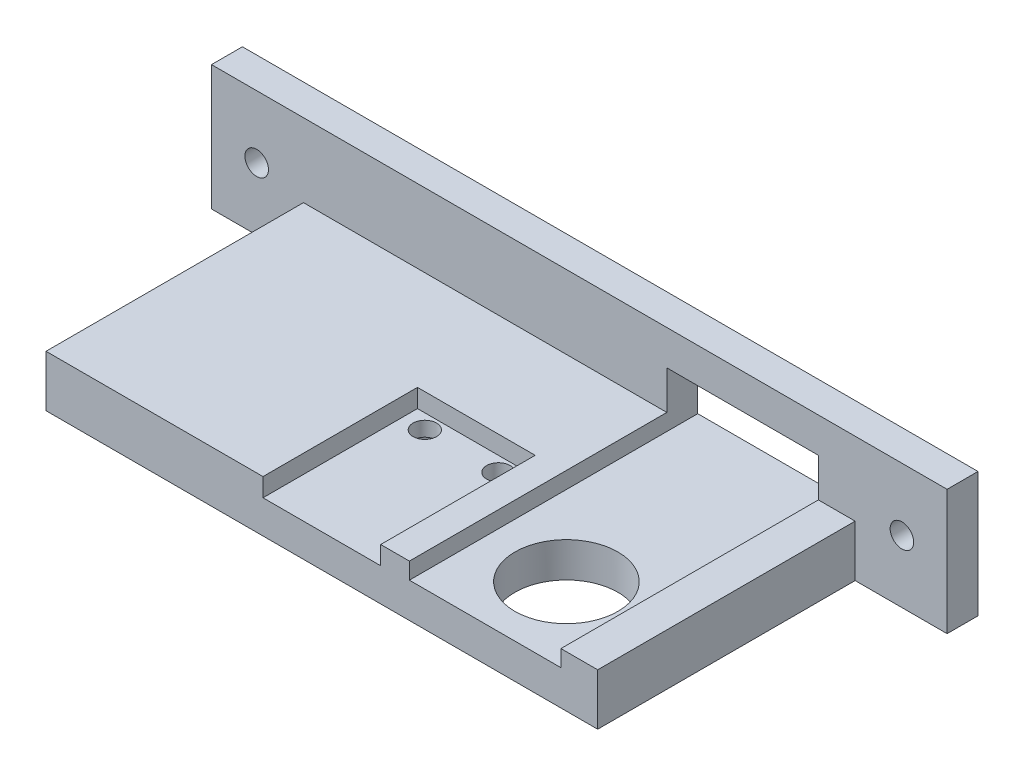
ISO-10303-21;
HEADER;
FILE_DESCRIPTION(('STEP AP214'),'2;1');
FILE_NAME('part.step','',(''),(''),'','','');
FILE_SCHEMA(('AUTOMOTIVE_DESIGN { 1 0 10303 214 1 1 1 1 }'));
ENDSEC;
DATA;
#1=APPLICATION_CONTEXT('core data for automotive mechanical design processes');
#2=APPLICATION_PROTOCOL_DEFINITION('international standard','automotive_design',2000,#1);
#3=PRODUCT_CONTEXT('',#1,'mechanical');
#4=PRODUCT('Part','Part','',(#3));
#5=PRODUCT_RELATED_PRODUCT_CATEGORY('part','',(#4));
#6=PRODUCT_DEFINITION_FORMATION('','',#4);
#7=PRODUCT_DEFINITION_CONTEXT('part definition',#1,'design');
#8=PRODUCT_DEFINITION('design','',#6,#7);
#9=PRODUCT_DEFINITION_SHAPE('','',#8);
#10=(LENGTH_UNIT() NAMED_UNIT(*) SI_UNIT(.MILLI.,.METRE.));
#11=(NAMED_UNIT(*) PLANE_ANGLE_UNIT() SI_UNIT($,.RADIAN.));
#12=(NAMED_UNIT(*) SI_UNIT($,.STERADIAN.) SOLID_ANGLE_UNIT());
#13=UNCERTAINTY_MEASURE_WITH_UNIT(LENGTH_MEASURE(1.E-05),#10,'distance_accuracy_value','');
#14=(GEOMETRIC_REPRESENTATION_CONTEXT(3) GLOBAL_UNCERTAINTY_ASSIGNED_CONTEXT((#13)) GLOBAL_UNIT_ASSIGNED_CONTEXT((#10,
#11,#12)) REPRESENTATION_CONTEXT('',''));
#15=CARTESIAN_POINT('',(0.,0.,0.));
#16=DIRECTION('',(0.,0.,1.));
#17=DIRECTION('',(1.,0.,0.));
#18=AXIS2_PLACEMENT_3D('',#15,#16,#17);
#19=CARTESIAN_POINT('',(0.,7.,0.));
#20=DIRECTION('',(0.,1.,0.));
#21=DIRECTION('',(0.,0.,1.));
#22=AXIS2_PLACEMENT_3D('',#19,#20,#21);
#23=PLANE('',#22);
#24=DIRECTION('',(0.,0.,1.));
#25=VECTOR('',#24,1.);
#26=CARTESIAN_POINT('',(11.9,7.,0.));
#27=LINE('',#26,#25);
#28=CARTESIAN_POINT('',(11.9,7.,-6.29809068669829));
#29=VERTEX_POINT('',#28);
#30=CARTESIAN_POINT('',(11.9,7.,28.7019093133017));
#31=VERTEX_POINT('',#30);
#32=EDGE_CURVE('E344',#29,#31,#27,.T.);
#33=ORIENTED_EDGE('',*,*,#32,.F.);
#34=DIRECTION('',(1.,0.,0.));
#35=VECTOR('',#34,1.);
#36=CARTESIAN_POINT('',(50.,7.,-6.29809068669829));
#37=LINE('',#36,#35);
#38=CARTESIAN_POINT('',(-37.5,7.,-6.29809068669829));
#39=VERTEX_POINT('',#38);
#40=EDGE_CURVE('E12',#39,#29,#37,.T.);
#41=ORIENTED_EDGE('',*,*,#40,.F.);
#42=DIRECTION('',(0.,0.,-1.));
#43=VECTOR('',#42,1.);
#44=CARTESIAN_POINT('',(-37.5,7.,0.));
#45=LINE('',#44,#43);
#46=CARTESIAN_POINT('',(-37.5,7.,28.7019093133017));
#47=VERTEX_POINT('',#46);
#48=EDGE_CURVE('E549',#47,#39,#45,.T.);
#49=ORIENTED_EDGE('',*,*,#48,.F.);
#50=DIRECTION('',(-1.,0.,0.));
#51=VECTOR('',#50,1.);
#52=CARTESIAN_POINT('',(37.5,7.,28.7019093133017));
#53=LINE('',#52,#51);
#54=CARTESIAN_POINT('',(-8.,7.,28.7019093133017));
#55=VERTEX_POINT('',#54);
#56=EDGE_CURVE('E606',#55,#47,#53,.T.);
#57=ORIENTED_EDGE('',*,*,#56,.F.);
#58=DIRECTION('',(0.,0.,1.));
#59=VECTOR('',#58,1.);
#60=CARTESIAN_POINT('',(-8.,7.,0.));
#61=LINE('',#60,#59);
#62=CARTESIAN_POINT('',(-8.,7.,7.70190931330171));
#63=VERTEX_POINT('',#62);
#64=EDGE_CURVE('E514',#63,#55,#61,.T.);
#65=ORIENTED_EDGE('',*,*,#64,.F.);
#66=DIRECTION('',(-1.,0.,0.));
#67=VECTOR('',#66,1.);
#68=CARTESIAN_POINT('',(0.,7.,7.70190931330171));
#69=LINE('',#68,#67);
#70=CARTESIAN_POINT('',(8.,7.,7.70190931330171));
#71=VERTEX_POINT('',#70);
#72=EDGE_CURVE('E529',#71,#63,#69,.T.);
#73=ORIENTED_EDGE('',*,*,#72,.F.);
#74=DIRECTION('',(0.,0.,1.));
#75=VECTOR('',#74,1.);
#76=CARTESIAN_POINT('',(8.,7.,0.));
#77=LINE('',#76,#75);
#78=CARTESIAN_POINT('',(8.,7.,28.7019093133017));
#79=VERTEX_POINT('',#78);
#80=EDGE_CURVE('E504',#71,#79,#77,.T.);
#81=ORIENTED_EDGE('',*,*,#80,.T.);
#82=EDGE_CURVE('E605',#31,#79,#53,.T.);
#83=ORIENTED_EDGE('',*,*,#82,.F.);
#84=EDGE_LOOP('',(#33,#41,#49,#57,#65,#73,#81,#83));
#85=FACE_BOUND('',#84,.T.);
#86=ADVANCED_FACE('F77',(#85),#23,.T.);
#87=CARTESIAN_POINT('',(5.,0.,9.7019093133017));
#88=DIRECTION('',(0.,1.,0.));
#89=DIRECTION('',(0.,0.,1.));
#90=AXIS2_PLACEMENT_3D('',#87,#88,#89);
#91=CYLINDRICAL_SURFACE('',#90,1.6);
#92=CARTESIAN_POINT('',(5.,4.5,9.7019093133017));
#93=DIRECTION('',(0.,1.,0.));
#94=DIRECTION('',(0.,0.,1.));
#95=AXIS2_PLACEMENT_3D('',#92,#93,#94);
#96=CIRCLE('',#95,1.6);
#97=CARTESIAN_POINT('',(5.,4.5,11.3019093133017));
#98=VERTEX_POINT('',#97);
#99=EDGE_CURVE('E505',#98,#98,#96,.T.);
#100=ORIENTED_EDGE('',*,*,#99,.T.);
#101=EDGE_LOOP('',(#100));
#102=FACE_BOUND('',#101,.T.);
#103=CARTESIAN_POINT('',(5.,2.5,9.7019093133017));
#104=DIRECTION('',(0.,-1.,0.));
#105=DIRECTION('',(0.,0.,-1.));
#106=AXIS2_PLACEMENT_3D('',#103,#104,#105);
#107=CIRCLE('',#106,1.6);
#108=CARTESIAN_POINT('',(5.,2.5,8.1019093133017));
#109=VERTEX_POINT('',#108);
#110=EDGE_CURVE('E509',#109,#109,#107,.F.);
#111=ORIENTED_EDGE('',*,*,#110,.F.);
#112=EDGE_LOOP('',(#111));
#113=FACE_BOUND('',#112,.T.);
#114=ADVANCED_FACE('F624',(#102,#113),#91,.F.);
#115=CARTESIAN_POINT('',(-5.,0.,9.70190931330171));
#116=DIRECTION('',(0.,1.,0.));
#117=DIRECTION('',(0.,0.,1.));
#118=AXIS2_PLACEMENT_3D('',#115,#116,#117);
#119=CYLINDRICAL_SURFACE('',#118,1.6);
#120=CARTESIAN_POINT('',(-5.,4.5,9.70190931330171));
#121=DIRECTION('',(0.,1.,0.));
#122=DIRECTION('',(0.,0.,1.));
#123=AXIS2_PLACEMENT_3D('',#120,#121,#122);
#124=CIRCLE('',#123,1.6);
#125=CARTESIAN_POINT('',(-5.,4.5,11.3019093133017));
#126=VERTEX_POINT('',#125);
#127=EDGE_CURVE('E500',#126,#126,#124,.T.);
#128=ORIENTED_EDGE('',*,*,#127,.T.);
#129=EDGE_LOOP('',(#128));
#130=FACE_BOUND('',#129,.T.);
#131=CARTESIAN_POINT('',(-5.,2.5,9.70190931330171));
#132=DIRECTION('',(0.,-1.,0.));
#133=DIRECTION('',(0.,0.,-1.));
#134=AXIS2_PLACEMENT_3D('',#131,#132,#133);
#135=CIRCLE('',#134,1.6);
#136=CARTESIAN_POINT('',(-5.,2.5,8.10190931330171));
#137=VERTEX_POINT('',#136);
#138=EDGE_CURVE('E420',#137,#137,#135,.F.);
#139=ORIENTED_EDGE('',*,*,#138,.F.);
#140=EDGE_LOOP('',(#139));
#141=FACE_BOUND('',#140,.T.);
#142=ADVANCED_FACE('F626',(#130,#141),#119,.F.);
#143=DIRECTION('',(0.,0.,-1.));
#144=VECTOR('',#143,1.);
#145=CARTESIAN_POINT('',(32.5,7.,0.));
#146=LINE('',#145,#144);
#147=CARTESIAN_POINT('',(32.5,7.,28.7019093133017));
#148=VERTEX_POINT('',#147);
#149=CARTESIAN_POINT('',(32.5,7.,-6.29809068669829));
#150=VERTEX_POINT('',#149);
#151=EDGE_CURVE('E337',#148,#150,#146,.T.);
#152=ORIENTED_EDGE('',*,*,#151,.F.);
#153=CARTESIAN_POINT('',(37.5,7.,28.7019093133017));
#154=VERTEX_POINT('',#153);
#155=EDGE_CURVE('E304',#154,#148,#53,.T.);
#156=ORIENTED_EDGE('',*,*,#155,.F.);
#157=DIRECTION('',(0.,0.,-1.));
#158=VECTOR('',#157,1.);
#159=CARTESIAN_POINT('',(37.5,7.,0.));
#160=LINE('',#159,#158);
#161=CARTESIAN_POINT('',(37.5,7.,-6.29809068669829));
#162=VERTEX_POINT('',#161);
#163=EDGE_CURVE('E553',#154,#162,#160,.T.);
#164=ORIENTED_EDGE('',*,*,#163,.T.);
#165=EDGE_CURVE('E87',#150,#162,#37,.T.);
#166=ORIENTED_EDGE('',*,*,#165,.F.);
#167=EDGE_LOOP('',(#152,#156,#164,#166));
#168=FACE_BOUND('',#167,.T.);
#169=ADVANCED_FACE('F633',(#168),#23,.T.);
#170=CARTESIAN_POINT('',(37.5,7.,28.7019093133017));
#171=DIRECTION('',(0.,0.,1.));
#172=DIRECTION('',(1.,0.,0.));
#173=AXIS2_PLACEMENT_3D('',#170,#171,#172);
#174=PLANE('',#173);
#175=DIRECTION('',(0.,1.,0.));
#176=VECTOR('',#175,1.);
#177=CARTESIAN_POINT('',(11.9,12.25,28.7019093133017));
#178=LINE('',#177,#176);
#179=CARTESIAN_POINT('',(11.9,4.74999999999999,28.7019093133017));
#180=VERTEX_POINT('',#179);
#181=EDGE_CURVE('E306',#180,#31,#178,.T.);
#182=ORIENTED_EDGE('',*,*,#181,.T.);
#183=ORIENTED_EDGE('',*,*,#82,.T.);
#184=DIRECTION('',(0.,1.,0.));
#185=VECTOR('',#184,1.);
#186=CARTESIAN_POINT('',(8.,4.5,28.7019093133017));
#187=LINE('',#186,#185);
#188=CARTESIAN_POINT('',(8.,4.5,28.7019093133017));
#189=VERTEX_POINT('',#188);
#190=EDGE_CURVE('E535',#189,#79,#187,.T.);
#191=ORIENTED_EDGE('',*,*,#190,.F.);
#192=DIRECTION('',(1.,0.,0.));
#193=VECTOR('',#192,1.);
#194=CARTESIAN_POINT('',(0.,4.5,28.7019093133017));
#195=LINE('',#194,#193);
#196=CARTESIAN_POINT('',(-8.,4.5,28.7019093133017));
#197=VERTEX_POINT('',#196);
#198=EDGE_CURVE('E521',#197,#189,#195,.T.);
#199=ORIENTED_EDGE('',*,*,#198,.F.);
#200=DIRECTION('',(0.,1.,0.));
#201=VECTOR('',#200,1.);
#202=CARTESIAN_POINT('',(-8.,4.5,28.7019093133017));
#203=LINE('',#202,#201);
#204=EDGE_CURVE('E540',#197,#55,#203,.T.);
#205=ORIENTED_EDGE('',*,*,#204,.T.);
#206=ORIENTED_EDGE('',*,*,#56,.T.);
#207=DIRECTION('',(0.,-1.,0.));
#208=VECTOR('',#207,1.);
#209=CARTESIAN_POINT('',(-37.5,7.,28.7019093133017));
#210=LINE('',#209,#208);
#211=CARTESIAN_POINT('',(-37.5,0.,28.7019093133017));
#212=VERTEX_POINT('',#211);
#213=EDGE_CURVE('E604',#47,#212,#210,.T.);
#214=ORIENTED_EDGE('',*,*,#213,.T.);
#215=DIRECTION('',(-1.,0.,0.));
#216=VECTOR('',#215,1.);
#217=CARTESIAN_POINT('',(37.5,0.,28.7019093133017));
#218=LINE('',#217,#216);
#219=CARTESIAN_POINT('',(37.5,0.,28.7019093133017));
#220=VERTEX_POINT('',#219);
#221=EDGE_CURVE('E539',#220,#212,#218,.T.);
#222=ORIENTED_EDGE('',*,*,#221,.F.);
#223=DIRECTION('',(0.,-1.,0.));
#224=VECTOR('',#223,1.);
#225=CARTESIAN_POINT('',(37.5,7.,28.7019093133017));
#226=LINE('',#225,#224);
#227=EDGE_CURVE('E564',#154,#220,#226,.T.);
#228=ORIENTED_EDGE('',*,*,#227,.F.);
#229=ORIENTED_EDGE('',*,*,#155,.T.);
#230=DIRECTION('',(0.,-1.,0.));
#231=VECTOR('',#230,1.);
#232=CARTESIAN_POINT('',(32.5,12.25,28.7019093133017));
#233=LINE('',#232,#231);
#234=CARTESIAN_POINT('',(32.5,4.74999999999999,28.7019093133017));
#235=VERTEX_POINT('',#234);
#236=EDGE_CURVE('E281',#148,#235,#233,.T.);
#237=ORIENTED_EDGE('',*,*,#236,.T.);
#238=DIRECTION('',(-1.,0.,0.));
#239=VECTOR('',#238,1.);
#240=CARTESIAN_POINT('',(32.5,4.74999999999999,28.7019093133017));
#241=LINE('',#240,#239);
#242=EDGE_CURVE('E292',#235,#180,#241,.T.);
#243=ORIENTED_EDGE('',*,*,#242,.T.);
#244=EDGE_LOOP('',(#182,#183,#191,#199,#205,#206,#214,#222,#228,#229,#237,#243));
#245=FACE_BOUND('',#244,.T.);
#246=ADVANCED_FACE('F79',(#245),#174,.T.);
#247=CARTESIAN_POINT('',(-37.5,7.,0.));
#248=DIRECTION('',(-1.,0.,0.));
#249=DIRECTION('',(0.,0.,1.));
#250=AXIS2_PLACEMENT_3D('',#247,#248,#249);
#251=PLANE('',#250);
#252=DIRECTION('',(0.,0.,-1.));
#253=VECTOR('',#252,1.);
#254=CARTESIAN_POINT('',(-37.5,0.,0.));
#255=LINE('',#254,#253);
#256=CARTESIAN_POINT('',(-37.5,0.,-6.29809068669829));
#257=VERTEX_POINT('',#256);
#258=EDGE_CURVE('E568',#212,#257,#255,.T.);
#259=ORIENTED_EDGE('',*,*,#258,.F.);
#260=ORIENTED_EDGE('',*,*,#213,.F.);
#261=ORIENTED_EDGE('',*,*,#48,.T.);
#262=DIRECTION('',(0.,-1.,0.));
#263=VECTOR('',#262,1.);
#264=CARTESIAN_POINT('',(-37.5,7.,-6.29809068669829));
#265=LINE('',#264,#263);
#266=EDGE_CURVE('E595',#39,#257,#265,.T.);
#267=ORIENTED_EDGE('',*,*,#266,.T.);
#268=EDGE_LOOP('',(#259,#260,#261,#267));
#269=FACE_BOUND('',#268,.T.);
#270=ADVANCED_FACE('F664',(#269),#251,.T.);
#271=CARTESIAN_POINT('',(0.,0.,0.));
#272=DIRECTION('',(0.,1.,0.));
#273=DIRECTION('',(0.,0.,1.));
#274=AXIS2_PLACEMENT_3D('',#271,#272,#273);
#275=PLANE('',#274);
#276=CARTESIAN_POINT('',(22.75,0.,18.2019093133017));
#277=DIRECTION('',(0.,1.,0.));
#278=DIRECTION('',(0.,0.,1.));
#279=AXIS2_PLACEMENT_3D('',#276,#277,#278);
#280=CIRCLE('',#279,7.);
#281=CARTESIAN_POINT('',(22.75,0.,25.2019093133017));
#282=VERTEX_POINT('',#281);
#283=EDGE_CURVE('E362',#282,#282,#280,.T.);
#284=ORIENTED_EDGE('',*,*,#283,.T.);
#285=EDGE_LOOP('',(#284));
#286=FACE_BOUND('',#285,.T.);
#287=DIRECTION('',(-0.992565006602262,0.,-0.121715683741458));
#288=VECTOR('',#287,1.);
#289=CARTESIAN_POINT('',(6.21170825034031,0.,12.5552868060386));
#290=LINE('',#289,#288);
#291=CARTESIAN_POINT('',(6.21170825034031,0.,12.5552868060386));
#292=VERTEX_POINT('',#291);
#293=CARTESIAN_POINT('',(3.1347567298733,0.,12.17796818644));
#294=VERTEX_POINT('',#293);
#295=EDGE_CURVE('E397',#292,#294,#290,.T.);
#296=ORIENTED_EDGE('',*,*,#295,.F.);
#297=DIRECTION('',(-0.601691377460227,0.,0.798728668754299));
#298=VECTOR('',#297,1.);
#299=CARTESIAN_POINT('',(8.07695152046701,0.,10.0792279329002));
#300=LINE('',#299,#298);
#301=CARTESIAN_POINT('',(8.07695152046701,0.,10.0792279329002));
#302=VERTEX_POINT('',#301);
#303=EDGE_CURVE('E394',#302,#292,#300,.T.);
#304=ORIENTED_EDGE('',*,*,#303,.F.);
#305=DIRECTION('',(0.390873629142036,0.,0.920444352495757));
#306=VECTOR('',#305,1.);
#307=CARTESIAN_POINT('',(6.8652432701267,0.,7.22585044016338));
#308=LINE('',#307,#306);
#309=CARTESIAN_POINT('',(6.8652432701267,0.,7.22585044016338));
#310=VERTEX_POINT('',#309);
#311=EDGE_CURVE('E373',#310,#302,#308,.T.);
#312=ORIENTED_EDGE('',*,*,#311,.F.);
#313=DIRECTION('',(0.992565006602263,0.,0.121715683741458));
#314=VECTOR('',#313,1.);
#315=CARTESIAN_POINT('',(3.78829174965969,0.,6.84853182056486));
#316=LINE('',#315,#314);
#317=CARTESIAN_POINT('',(3.78829174965969,0.,6.84853182056486));
#318=VERTEX_POINT('',#317);
#319=EDGE_CURVE('E410',#318,#310,#316,.T.);
#320=ORIENTED_EDGE('',*,*,#319,.F.);
#321=DIRECTION('',(0.601691377460227,0.,-0.798728668754299));
#322=VECTOR('',#321,1.);
#323=CARTESIAN_POINT('',(1.92304847953298,0.,9.32459069370318));
#324=LINE('',#323,#322);
#325=CARTESIAN_POINT('',(1.92304847953298,0.,9.32459069370318));
#326=VERTEX_POINT('',#325);
#327=EDGE_CURVE('E406',#326,#318,#324,.T.);
#328=ORIENTED_EDGE('',*,*,#327,.F.);
#329=DIRECTION('',(-0.390873629142036,0.,-0.920444352495757));
#330=VECTOR('',#329,1.);
#331=CARTESIAN_POINT('',(3.1347567298733,0.,12.17796818644));
#332=LINE('',#331,#330);
#333=EDGE_CURVE('E402',#294,#326,#332,.T.);
#334=ORIENTED_EDGE('',*,*,#333,.F.);
#335=EDGE_LOOP('',(#296,#304,#312,#320,#328,#334));
#336=FACE_BOUND('',#335,.T.);
#337=DIRECTION('',(-0.992565006602262,0.,-0.121715683741459));
#338=VECTOR('',#337,1.);
#339=CARTESIAN_POINT('',(-3.78829174965969,0.,12.5552868060386));
#340=LINE('',#339,#338);
#341=CARTESIAN_POINT('',(-3.78829174965969,0.,12.5552868060386));
#342=VERTEX_POINT('',#341);
#343=CARTESIAN_POINT('',(-6.86524327012671,0.,12.17796818644));
#344=VERTEX_POINT('',#343);
#345=EDGE_CURVE('E464',#342,#344,#340,.T.);
#346=ORIENTED_EDGE('',*,*,#345,.F.);
#347=DIRECTION('',(-0.601691377460227,0.,0.798728668754299));
#348=VECTOR('',#347,1.);
#349=CARTESIAN_POINT('',(-1.92304847953299,0.,10.0792279329002));
#350=LINE('',#349,#348);
#351=CARTESIAN_POINT('',(-1.92304847953299,0.,10.0792279329002));
#352=VERTEX_POINT('',#351);
#353=EDGE_CURVE('E367',#352,#342,#350,.T.);
#354=ORIENTED_EDGE('',*,*,#353,.F.);
#355=DIRECTION('',(0.390873629142034,0.,0.920444352495758));
#356=VECTOR('',#355,1.);
#357=CARTESIAN_POINT('',(-3.13475672987329,0.,7.22585044016338));
#358=LINE('',#357,#356);
#359=CARTESIAN_POINT('',(-3.13475672987329,0.,7.22585044016338));
#360=VERTEX_POINT('',#359);
#361=EDGE_CURVE('E441',#360,#352,#358,.T.);
#362=ORIENTED_EDGE('',*,*,#361,.F.);
#363=DIRECTION('',(0.992565006602262,0.,0.121715683741459));
#364=VECTOR('',#363,1.);
#365=CARTESIAN_POINT('',(-6.21170825034031,0.,6.84853182056486));
#366=LINE('',#365,#364);
#367=CARTESIAN_POINT('',(-6.21170825034031,0.,6.84853182056486));
#368=VERTEX_POINT('',#367);
#369=EDGE_CURVE('E476',#368,#360,#366,.T.);
#370=ORIENTED_EDGE('',*,*,#369,.F.);
#371=DIRECTION('',(0.601691377460228,0.,-0.798728668754298));
#372=VECTOR('',#371,1.);
#373=CARTESIAN_POINT('',(-8.07695152046702,0.,9.32459069370318));
#374=LINE('',#373,#372);
#375=CARTESIAN_POINT('',(-8.07695152046702,0.,9.32459069370318));
#376=VERTEX_POINT('',#375);
#377=EDGE_CURVE('E472',#376,#368,#374,.T.);
#378=ORIENTED_EDGE('',*,*,#377,.F.);
#379=DIRECTION('',(-0.390873629142035,0.,-0.920444352495758));
#380=VECTOR('',#379,1.);
#381=CARTESIAN_POINT('',(-6.86524327012671,0.,12.17796818644));
#382=LINE('',#381,#380);
#383=EDGE_CURVE('E468',#344,#376,#382,.T.);
#384=ORIENTED_EDGE('',*,*,#383,.F.);
#385=EDGE_LOOP('',(#346,#354,#362,#370,#378,#384));
#386=FACE_BOUND('',#385,.T.);
#387=ORIENTED_EDGE('',*,*,#258,.T.);
#388=DIRECTION('',(1.,0.,0.));
#389=VECTOR('',#388,1.);
#390=CARTESIAN_POINT('',(0.,0.,-6.29809068669829));
#391=LINE('',#390,#389);
#392=CARTESIAN_POINT('',(-50.,0.,-6.29809068669829));
#393=VERTEX_POINT('',#392);
#394=EDGE_CURVE('E563',#393,#257,#391,.T.);
#395=ORIENTED_EDGE('',*,*,#394,.F.);
#396=DIRECTION('',(0.,0.,1.));
#397=VECTOR('',#396,1.);
#398=CARTESIAN_POINT('',(-50.,0.,0.));
#399=LINE('',#398,#397);
#400=CARTESIAN_POINT('',(-50.,0.,-10.5));
#401=VERTEX_POINT('',#400);
#402=EDGE_CURVE('E559',#401,#393,#399,.T.);
#403=ORIENTED_EDGE('',*,*,#402,.F.);
#404=DIRECTION('',(1.,0.,0.));
#405=VECTOR('',#404,1.);
#406=CARTESIAN_POINT('',(0.,0.,-10.5));
#407=LINE('',#406,#405);
#408=CARTESIAN_POINT('',(50.,0.,-10.5));
#409=VERTEX_POINT('',#408);
#410=EDGE_CURVE('E554',#401,#409,#407,.T.);
#411=ORIENTED_EDGE('',*,*,#410,.T.);
#412=DIRECTION('',(0.,0.,1.));
#413=VECTOR('',#412,1.);
#414=CARTESIAN_POINT('',(50.,0.,0.));
#415=LINE('',#414,#413);
#416=CARTESIAN_POINT('',(50.,0.,-6.29809068669829));
#417=VERTEX_POINT('',#416);
#418=EDGE_CURVE('E577',#409,#417,#415,.T.);
#419=ORIENTED_EDGE('',*,*,#418,.T.);
#420=CARTESIAN_POINT('',(37.5,0.,-6.29809068669829));
#421=VERTEX_POINT('',#420);
#422=EDGE_CURVE('E569',#421,#417,#391,.T.);
#423=ORIENTED_EDGE('',*,*,#422,.F.);
#424=DIRECTION('',(0.,0.,-1.));
#425=VECTOR('',#424,1.);
#426=CARTESIAN_POINT('',(37.5,0.,0.));
#427=LINE('',#426,#425);
#428=EDGE_CURVE('E573',#220,#421,#427,.T.);
#429=ORIENTED_EDGE('',*,*,#428,.F.);
#430=ORIENTED_EDGE('',*,*,#221,.T.);
#431=EDGE_LOOP('',(#387,#395,#403,#411,#419,#423,#429,#430));
#432=FACE_BOUND('',#431,.T.);
#433=ADVANCED_FACE('F661',(#286,#336,#386,#432),#275,.F.);
#434=CARTESIAN_POINT('',(37.5,7.,0.));
#435=DIRECTION('',(-1.,0.,0.));
#436=DIRECTION('',(0.,0.,1.));
#437=AXIS2_PLACEMENT_3D('',#434,#435,#436);
#438=PLANE('',#437);
#439=ORIENTED_EDGE('',*,*,#428,.T.);
#440=DIRECTION('',(0.,-1.,0.));
#441=VECTOR('',#440,1.);
#442=CARTESIAN_POINT('',(37.5,7.,-6.29809068669829));
#443=LINE('',#442,#441);
#444=EDGE_CURVE('E592',#162,#421,#443,.T.);
#445=ORIENTED_EDGE('',*,*,#444,.F.);
#446=ORIENTED_EDGE('',*,*,#163,.F.);
#447=ORIENTED_EDGE('',*,*,#227,.T.);
#448=EDGE_LOOP('',(#439,#445,#446,#447));
#449=FACE_BOUND('',#448,.T.);
#450=ADVANCED_FACE('F657',(#449),#438,.F.);
#451=CARTESIAN_POINT('',(0.,7.,-6.29809068669829));
#452=DIRECTION('',(0.,0.,-1.));
#453=DIRECTION('',(-1.,0.,0.));
#454=AXIS2_PLACEMENT_3D('',#451,#452,#453);
#455=PLANE('',#454);
#456=CARTESIAN_POINT('',(43.86,8.49999999999999,-6.29809068669829));
#457=DIRECTION('',(0.,0.,-1.));
#458=DIRECTION('',(-1.,0.,0.));
#459=AXIS2_PLACEMENT_3D('',#456,#457,#458);
#460=CIRCLE('',#459,1.6);
#461=CARTESIAN_POINT('',(42.26,8.49999999999999,-6.29809068669829));
#462=VERTEX_POINT('',#461);
#463=EDGE_CURVE('E316',#462,#462,#460,.T.);
#464=ORIENTED_EDGE('',*,*,#463,.T.);
#465=EDGE_LOOP('',(#464));
#466=FACE_BOUND('',#465,.T.);
#467=CARTESIAN_POINT('',(-43.86,8.5,-6.29809068669829));
#468=DIRECTION('',(0.,0.,-1.));
#469=DIRECTION('',(-1.,0.,0.));
#470=AXIS2_PLACEMENT_3D('',#467,#468,#469);
#471=CIRCLE('',#470,1.6);
#472=CARTESIAN_POINT('',(-45.46,8.5,-6.29809068669829));
#473=VERTEX_POINT('',#472);
#474=EDGE_CURVE('E939',#473,#473,#471,.T.);
#475=ORIENTED_EDGE('',*,*,#474,.T.);
#476=EDGE_LOOP('',(#475));
#477=FACE_BOUND('',#476,.T.);
#478=ORIENTED_EDGE('',*,*,#40,.T.);
#479=DIRECTION('',(0.,1.,0.));
#480=VECTOR('',#479,1.);
#481=CARTESIAN_POINT('',(11.9,7.,-6.29809068669829));
#482=LINE('',#481,#480);
#483=CARTESIAN_POINT('',(11.9,12.25,-6.29809068669829));
#484=VERTEX_POINT('',#483);
#485=EDGE_CURVE('E340',#29,#484,#482,.T.);
#486=ORIENTED_EDGE('',*,*,#485,.T.);
#487=DIRECTION('',(1.,0.,0.));
#488=VECTOR('',#487,1.);
#489=CARTESIAN_POINT('',(0.,12.25,-6.29809068669829));
#490=LINE('',#489,#488);
#491=CARTESIAN_POINT('',(32.5,12.25,-6.29809068669829));
#492=VERTEX_POINT('',#491);
#493=EDGE_CURVE('E329',#484,#492,#490,.T.);
#494=ORIENTED_EDGE('',*,*,#493,.T.);
#495=DIRECTION('',(0.,-1.,0.));
#496=VECTOR('',#495,1.);
#497=CARTESIAN_POINT('',(32.5,7.,-6.29809068669829));
#498=LINE('',#497,#496);
#499=EDGE_CURVE('E333',#492,#150,#498,.T.);
#500=ORIENTED_EDGE('',*,*,#499,.T.);
#501=ORIENTED_EDGE('',*,*,#165,.T.);
#502=ORIENTED_EDGE('',*,*,#444,.T.);
#503=ORIENTED_EDGE('',*,*,#422,.T.);
#504=DIRECTION('',(0.,-1.,0.));
#505=VECTOR('',#504,1.);
#506=CARTESIAN_POINT('',(50.,7.,-6.29809068669829));
#507=LINE('',#506,#505);
#508=CARTESIAN_POINT('',(50.,17.,-6.29809068669829));
#509=VERTEX_POINT('',#508);
#510=EDGE_CURVE('E589',#509,#417,#507,.T.);
#511=ORIENTED_EDGE('',*,*,#510,.F.);
#512=DIRECTION('',(1.,0.,0.));
#513=VECTOR('',#512,1.);
#514=CARTESIAN_POINT('',(50.,17.,-6.29809068669829));
#515=LINE('',#514,#513);
#516=CARTESIAN_POINT('',(-50.,17.,-6.29809068669829));
#517=VERTEX_POINT('',#516);
#518=EDGE_CURVE('E359',#517,#509,#515,.T.);
#519=ORIENTED_EDGE('',*,*,#518,.F.);
#520=DIRECTION('',(0.,-1.,0.));
#521=VECTOR('',#520,1.);
#522=CARTESIAN_POINT('',(-50.,7.,-6.29809068669829));
#523=LINE('',#522,#521);
#524=EDGE_CURVE('E598',#517,#393,#523,.T.);
#525=ORIENTED_EDGE('',*,*,#524,.T.);
#526=ORIENTED_EDGE('',*,*,#394,.T.);
#527=ORIENTED_EDGE('',*,*,#266,.F.);
#528=EDGE_LOOP('',(#478,#486,#494,#500,#501,#502,#503,#511,#519,#525,#526,#527));
#529=FACE_BOUND('',#528,.T.);
#530=ADVANCED_FACE('F673',(#466,#477,#529),#455,.F.);
#531=CARTESIAN_POINT('',(50.,7.,0.));
#532=DIRECTION('',(1.,0.,0.));
#533=DIRECTION('',(0.,0.,-1.));
#534=AXIS2_PLACEMENT_3D('',#531,#532,#533);
#535=PLANE('',#534);
#536=ORIENTED_EDGE('',*,*,#418,.F.);
#537=DIRECTION('',(0.,-1.,0.));
#538=VECTOR('',#537,1.);
#539=CARTESIAN_POINT('',(50.,7.,-10.5));
#540=LINE('',#539,#538);
#541=CARTESIAN_POINT('',(50.,17.,-10.5));
#542=VERTEX_POINT('',#541);
#543=EDGE_CURVE('E586',#542,#409,#540,.T.);
#544=ORIENTED_EDGE('',*,*,#543,.F.);
#545=DIRECTION('',(0.,0.,-1.));
#546=VECTOR('',#545,1.);
#547=CARTESIAN_POINT('',(50.,17.,-6.29809068669829));
#548=LINE('',#547,#546);
#549=EDGE_CURVE('E347',#509,#542,#548,.T.);
#550=ORIENTED_EDGE('',*,*,#549,.F.);
#551=ORIENTED_EDGE('',*,*,#510,.T.);
#552=EDGE_LOOP('',(#536,#544,#550,#551));
#553=FACE_BOUND('',#552,.T.);
#554=ADVANCED_FACE('F669',(#553),#535,.T.);
#555=CARTESIAN_POINT('',(0.,7.,-10.5));
#556=DIRECTION('',(0.,0.,-1.));
#557=DIRECTION('',(-1.,0.,0.));
#558=AXIS2_PLACEMENT_3D('',#555,#556,#557);
#559=PLANE('',#558);
#560=CARTESIAN_POINT('',(43.86,8.49999999999999,-10.5));
#561=DIRECTION('',(0.,0.,-1.));
#562=DIRECTION('',(-1.,0.,0.));
#563=AXIS2_PLACEMENT_3D('',#560,#561,#562);
#564=CIRCLE('',#563,1.6);
#565=CARTESIAN_POINT('',(42.26,8.49999999999999,-10.5));
#566=VERTEX_POINT('',#565);
#567=EDGE_CURVE('E935',#566,#566,#564,.T.);
#568=ORIENTED_EDGE('',*,*,#567,.F.);
#569=EDGE_LOOP('',(#568));
#570=FACE_BOUND('',#569,.T.);
#571=CARTESIAN_POINT('',(-43.86,8.5,-10.5));
#572=DIRECTION('',(0.,0.,-1.));
#573=DIRECTION('',(-1.,0.,0.));
#574=AXIS2_PLACEMENT_3D('',#571,#572,#573);
#575=CIRCLE('',#574,1.6);
#576=CARTESIAN_POINT('',(-45.46,8.5,-10.5));
#577=VERTEX_POINT('',#576);
#578=EDGE_CURVE('E944',#577,#577,#575,.T.);
#579=ORIENTED_EDGE('',*,*,#578,.F.);
#580=EDGE_LOOP('',(#579));
#581=FACE_BOUND('',#580,.T.);
#582=DIRECTION('',(0.,1.,0.));
#583=VECTOR('',#582,1.);
#584=CARTESIAN_POINT('',(11.9,12.25,-10.5));
#585=LINE('',#584,#583);
#586=CARTESIAN_POINT('',(11.9,4.74999999999999,-10.5));
#587=VERTEX_POINT('',#586);
#588=CARTESIAN_POINT('',(11.9,12.25,-10.5));
#589=VERTEX_POINT('',#588);
#590=EDGE_CURVE('E103',#587,#589,#585,.T.);
#591=ORIENTED_EDGE('',*,*,#590,.F.);
#592=DIRECTION('',(-1.,0.,0.));
#593=VECTOR('',#592,1.);
#594=CARTESIAN_POINT('',(32.5,4.74999999999999,-10.5));
#595=LINE('',#594,#593);
#596=CARTESIAN_POINT('',(32.5,4.74999999999999,-10.5));
#597=VERTEX_POINT('',#596);
#598=EDGE_CURVE('E309',#597,#587,#595,.T.);
#599=ORIENTED_EDGE('',*,*,#598,.F.);
#600=DIRECTION('',(0.,-1.,0.));
#601=VECTOR('',#600,1.);
#602=CARTESIAN_POINT('',(32.5,12.25,-10.5));
#603=LINE('',#602,#601);
#604=CARTESIAN_POINT('',(32.5,12.25,-10.5));
#605=VERTEX_POINT('',#604);
#606=EDGE_CURVE('E284',#605,#597,#603,.T.);
#607=ORIENTED_EDGE('',*,*,#606,.F.);
#608=DIRECTION('',(1.,0.,0.));
#609=VECTOR('',#608,1.);
#610=CARTESIAN_POINT('',(32.5,12.25,-10.5));
#611=LINE('',#610,#609);
#612=EDGE_CURVE('E315',#589,#605,#611,.T.);
#613=ORIENTED_EDGE('',*,*,#612,.F.);
#614=EDGE_LOOP('',(#591,#599,#607,#613));
#615=FACE_BOUND('',#614,.T.);
#616=ORIENTED_EDGE('',*,*,#410,.F.);
#617=DIRECTION('',(0.,-1.,0.));
#618=VECTOR('',#617,1.);
#619=CARTESIAN_POINT('',(-50.,7.,-10.5));
#620=LINE('',#619,#618);
#621=CARTESIAN_POINT('',(-50.,17.,-10.5));
#622=VERTEX_POINT('',#621);
#623=EDGE_CURVE('E558',#622,#401,#620,.T.);
#624=ORIENTED_EDGE('',*,*,#623,.F.);
#625=DIRECTION('',(-1.,0.,0.));
#626=VECTOR('',#625,1.);
#627=CARTESIAN_POINT('',(50.,17.,-10.5));
#628=LINE('',#627,#626);
#629=EDGE_CURVE('E351',#542,#622,#628,.T.);
#630=ORIENTED_EDGE('',*,*,#629,.F.);
#631=ORIENTED_EDGE('',*,*,#543,.T.);
#632=EDGE_LOOP('',(#616,#624,#630,#631));
#633=FACE_BOUND('',#632,.T.);
#634=ADVANCED_FACE('F666',(#570,#581,#615,#633),#559,.T.);
#635=CARTESIAN_POINT('',(-50.,7.,0.));
#636=DIRECTION('',(1.,0.,0.));
#637=DIRECTION('',(0.,0.,-1.));
#638=AXIS2_PLACEMENT_3D('',#635,#636,#637);
#639=PLANE('',#638);
#640=ORIENTED_EDGE('',*,*,#402,.T.);
#641=ORIENTED_EDGE('',*,*,#524,.F.);
#642=DIRECTION('',(0.,0.,1.));
#643=VECTOR('',#642,1.);
#644=CARTESIAN_POINT('',(-50.,17.,-6.29809068669829));
#645=LINE('',#644,#643);
#646=EDGE_CURVE('E355',#622,#517,#645,.T.);
#647=ORIENTED_EDGE('',*,*,#646,.F.);
#648=ORIENTED_EDGE('',*,*,#623,.T.);
#649=EDGE_LOOP('',(#640,#641,#647,#648));
#650=FACE_BOUND('',#649,.T.);
#651=ADVANCED_FACE('F655',(#650),#639,.F.);
#652=CARTESIAN_POINT('',(8.,4.5,0.));
#653=DIRECTION('',(-1.,0.,0.));
#654=DIRECTION('',(0.,0.,1.));
#655=AXIS2_PLACEMENT_3D('',#652,#653,#654);
#656=PLANE('',#655);
#657=ORIENTED_EDGE('',*,*,#80,.F.);
#658=DIRECTION('',(0.,1.,0.));
#659=VECTOR('',#658,1.);
#660=CARTESIAN_POINT('',(8.,4.5,7.70190931330171));
#661=LINE('',#660,#659);
#662=CARTESIAN_POINT('',(8.,4.5,7.70190931330171));
#663=VERTEX_POINT('',#662);
#664=EDGE_CURVE('E525',#663,#71,#661,.T.);
#665=ORIENTED_EDGE('',*,*,#664,.F.);
#666=DIRECTION('',(0.,0.,1.));
#667=VECTOR('',#666,1.);
#668=CARTESIAN_POINT('',(8.,4.5,0.));
#669=LINE('',#668,#667);
#670=EDGE_CURVE('E510',#663,#189,#669,.T.);
#671=ORIENTED_EDGE('',*,*,#670,.T.);
#672=ORIENTED_EDGE('',*,*,#190,.T.);
#673=EDGE_LOOP('',(#657,#665,#671,#672));
#674=FACE_BOUND('',#673,.T.);
#675=ADVANCED_FACE('F649',(#674),#656,.T.);
#676=CARTESIAN_POINT('',(-8.,4.5,0.));
#677=DIRECTION('',(-1.,0.,0.));
#678=DIRECTION('',(0.,0.,1.));
#679=AXIS2_PLACEMENT_3D('',#676,#677,#678);
#680=PLANE('',#679);
#681=ORIENTED_EDGE('',*,*,#64,.T.);
#682=ORIENTED_EDGE('',*,*,#204,.F.);
#683=DIRECTION('',(0.,0.,1.));
#684=VECTOR('',#683,1.);
#685=CARTESIAN_POINT('',(-8.,4.5,0.));
#686=LINE('',#685,#684);
#687=CARTESIAN_POINT('',(-8.,4.5,7.70190931330171));
#688=VERTEX_POINT('',#687);
#689=EDGE_CURVE('E518',#688,#197,#686,.T.);
#690=ORIENTED_EDGE('',*,*,#689,.F.);
#691=DIRECTION('',(0.,1.,0.));
#692=VECTOR('',#691,1.);
#693=CARTESIAN_POINT('',(-8.,4.5,7.70190931330171));
#694=LINE('',#693,#692);
#695=EDGE_CURVE('E544',#688,#63,#694,.T.);
#696=ORIENTED_EDGE('',*,*,#695,.T.);
#697=EDGE_LOOP('',(#681,#682,#690,#696));
#698=FACE_BOUND('',#697,.T.);
#699=ADVANCED_FACE('F646',(#698),#680,.F.);
#700=CARTESIAN_POINT('',(0.,4.5,7.70190931330171));
#701=DIRECTION('',(0.,0.,-1.));
#702=DIRECTION('',(-1.,0.,0.));
#703=AXIS2_PLACEMENT_3D('',#700,#701,#702);
#704=PLANE('',#703);
#705=ORIENTED_EDGE('',*,*,#72,.T.);
#706=ORIENTED_EDGE('',*,*,#695,.F.);
#707=DIRECTION('',(-1.,0.,0.));
#708=VECTOR('',#707,1.);
#709=CARTESIAN_POINT('',(0.,4.5,7.70190931330171));
#710=LINE('',#709,#708);
#711=EDGE_CURVE('E513',#663,#688,#710,.T.);
#712=ORIENTED_EDGE('',*,*,#711,.F.);
#713=ORIENTED_EDGE('',*,*,#664,.T.);
#714=EDGE_LOOP('',(#705,#706,#712,#713));
#715=FACE_BOUND('',#714,.T.);
#716=ADVANCED_FACE('F644',(#715),#704,.F.);
#717=CARTESIAN_POINT('',(0.,4.5,0.));
#718=DIRECTION('',(0.,1.,0.));
#719=DIRECTION('',(0.,0.,1.));
#720=AXIS2_PLACEMENT_3D('',#717,#718,#719);
#721=PLANE('',#720);
#722=ORIENTED_EDGE('',*,*,#127,.F.);
#723=EDGE_LOOP('',(#722));
#724=FACE_BOUND('',#723,.T.);
#725=ORIENTED_EDGE('',*,*,#99,.F.);
#726=EDGE_LOOP('',(#725));
#727=FACE_BOUND('',#726,.T.);
#728=ORIENTED_EDGE('',*,*,#670,.F.);
#729=ORIENTED_EDGE('',*,*,#711,.T.);
#730=ORIENTED_EDGE('',*,*,#689,.T.);
#731=ORIENTED_EDGE('',*,*,#198,.T.);
#732=EDGE_LOOP('',(#728,#729,#730,#731));
#733=FACE_BOUND('',#732,.T.);
#734=ADVANCED_FACE('F640',(#724,#727,#733),#721,.T.);
#735=CARTESIAN_POINT('',(0.,2.5,0.));
#736=DIRECTION('',(0.,-1.,0.));
#737=DIRECTION('',(0.,0.,-1.));
#738=AXIS2_PLACEMENT_3D('',#735,#736,#737);
#739=PLANE('',#738);
#740=DIRECTION('',(-0.601691377460227,0.,0.798728668754299));
#741=VECTOR('',#740,1.);
#742=CARTESIAN_POINT('',(-1.92304847953299,2.5,10.0792279329002));
#743=LINE('',#742,#741);
#744=CARTESIAN_POINT('',(-1.92304847953299,2.5,10.0792279329002));
#745=VERTEX_POINT('',#744);
#746=CARTESIAN_POINT('',(-3.78829174965969,2.5,12.5552868060386));
#747=VERTEX_POINT('',#746);
#748=EDGE_CURVE('E436',#745,#747,#743,.T.);
#749=ORIENTED_EDGE('',*,*,#748,.T.);
#750=DIRECTION('',(-0.992565006602262,0.,-0.121715683741459));
#751=VECTOR('',#750,1.);
#752=CARTESIAN_POINT('',(-3.78829174965969,2.5,12.5552868060386));
#753=LINE('',#752,#751);
#754=CARTESIAN_POINT('',(-6.86524327012671,2.5,12.17796818644));
#755=VERTEX_POINT('',#754);
#756=EDGE_CURVE('E440',#747,#755,#753,.T.);
#757=ORIENTED_EDGE('',*,*,#756,.T.);
#758=DIRECTION('',(-0.390873629142035,0.,-0.920444352495758));
#759=VECTOR('',#758,1.);
#760=CARTESIAN_POINT('',(-6.86524327012671,2.5,12.17796818644));
#761=LINE('',#760,#759);
#762=CARTESIAN_POINT('',(-8.07695152046702,2.5,9.32459069370318));
#763=VERTEX_POINT('',#762);
#764=EDGE_CURVE('E445',#755,#763,#761,.T.);
#765=ORIENTED_EDGE('',*,*,#764,.T.);
#766=DIRECTION('',(0.601691377460228,0.,-0.798728668754298));
#767=VECTOR('',#766,1.);
#768=CARTESIAN_POINT('',(-8.07695152046702,2.5,9.32459069370318));
#769=LINE('',#768,#767);
#770=CARTESIAN_POINT('',(-6.21170825034031,2.5,6.84853182056486));
#771=VERTEX_POINT('',#770);
#772=EDGE_CURVE('E449',#763,#771,#769,.T.);
#773=ORIENTED_EDGE('',*,*,#772,.T.);
#774=DIRECTION('',(0.992565006602262,0.,0.121715683741459));
#775=VECTOR('',#774,1.);
#776=CARTESIAN_POINT('',(-6.21170825034031,2.5,6.84853182056486));
#777=LINE('',#776,#775);
#778=CARTESIAN_POINT('',(-3.13475672987329,2.5,7.22585044016338));
#779=VERTEX_POINT('',#778);
#780=EDGE_CURVE('E453',#771,#779,#777,.T.);
#781=ORIENTED_EDGE('',*,*,#780,.T.);
#782=DIRECTION('',(0.390873629142034,0.,0.920444352495758));
#783=VECTOR('',#782,1.);
#784=CARTESIAN_POINT('',(-3.13475672987329,2.5,7.22585044016338));
#785=LINE('',#784,#783);
#786=EDGE_CURVE('E457',#779,#745,#785,.T.);
#787=ORIENTED_EDGE('',*,*,#786,.T.);
#788=EDGE_LOOP('',(#749,#757,#765,#773,#781,#787));
#789=FACE_BOUND('',#788,.T.);
#790=ORIENTED_EDGE('',*,*,#138,.T.);
#791=EDGE_LOOP('',(#790));
#792=FACE_BOUND('',#791,.T.);
#793=ADVANCED_FACE('F643',(#789,#792),#739,.T.);
#794=CARTESIAN_POINT('',(-1.92304847953299,2.5,10.0792279329002));
#795=DIRECTION('',(0.798728668754299,0.,0.601691377460227));
#796=DIRECTION('',(0.601691377460227,0.,-0.798728668754299));
#797=AXIS2_PLACEMENT_3D('',#794,#795,#796);
#798=PLANE('',#797);
#799=ORIENTED_EDGE('',*,*,#353,.T.);
#800=DIRECTION('',(0.,-1.,0.));
#801=VECTOR('',#800,1.);
#802=CARTESIAN_POINT('',(-3.78829174965969,2.5,12.5552868060386));
#803=LINE('',#802,#801);
#804=EDGE_CURVE('E461',#747,#342,#803,.T.);
#805=ORIENTED_EDGE('',*,*,#804,.F.);
#806=ORIENTED_EDGE('',*,*,#748,.F.);
#807=DIRECTION('',(0.,-1.,0.));
#808=VECTOR('',#807,1.);
#809=CARTESIAN_POINT('',(-1.92304847953299,2.5,10.0792279329002));
#810=LINE('',#809,#808);
#811=EDGE_CURVE('E398',#745,#352,#810,.T.);
#812=ORIENTED_EDGE('',*,*,#811,.T.);
#813=EDGE_LOOP('',(#799,#805,#806,#812));
#814=FACE_BOUND('',#813,.T.);
#815=ADVANCED_FACE('F761',(#814),#798,.F.);
#816=CARTESIAN_POINT('',(-3.13475672987329,2.5,7.22585044016338));
#817=DIRECTION('',(0.920444352495758,0.,-0.390873629142034));
#818=DIRECTION('',(-0.390873629142034,0.,-0.920444352495758));
#819=AXIS2_PLACEMENT_3D('',#816,#817,#818);
#820=PLANE('',#819);
#821=ORIENTED_EDGE('',*,*,#361,.T.);
#822=ORIENTED_EDGE('',*,*,#811,.F.);
#823=ORIENTED_EDGE('',*,*,#786,.F.);
#824=DIRECTION('',(0.,-1.,0.));
#825=VECTOR('',#824,1.);
#826=CARTESIAN_POINT('',(-3.13475672987329,2.5,7.22585044016338));
#827=LINE('',#826,#825);
#828=EDGE_CURVE('E485',#779,#360,#827,.T.);
#829=ORIENTED_EDGE('',*,*,#828,.T.);
#830=EDGE_LOOP('',(#821,#822,#823,#829));
#831=FACE_BOUND('',#830,.T.);
#832=ADVANCED_FACE('F763',(#831),#820,.F.);
#833=CARTESIAN_POINT('',(-6.21170825034031,2.5,6.84853182056486));
#834=DIRECTION('',(0.121715683741459,0.,-0.992565006602262));
#835=DIRECTION('',(-0.992565006602262,0.,-0.121715683741459));
#836=AXIS2_PLACEMENT_3D('',#833,#834,#835);
#837=PLANE('',#836);
#838=ORIENTED_EDGE('',*,*,#369,.T.);
#839=ORIENTED_EDGE('',*,*,#828,.F.);
#840=ORIENTED_EDGE('',*,*,#780,.F.);
#841=DIRECTION('',(0.,-1.,0.));
#842=VECTOR('',#841,1.);
#843=CARTESIAN_POINT('',(-6.21170825034031,2.5,6.84853182056486));
#844=LINE('',#843,#842);
#845=EDGE_CURVE('E488',#771,#368,#844,.T.);
#846=ORIENTED_EDGE('',*,*,#845,.T.);
#847=EDGE_LOOP('',(#838,#839,#840,#846));
#848=FACE_BOUND('',#847,.T.);
#849=ADVANCED_FACE('F766',(#848),#837,.F.);
#850=CARTESIAN_POINT('',(-8.07695152046702,2.5,9.32459069370318));
#851=DIRECTION('',(-0.798728668754298,0.,-0.601691377460228));
#852=DIRECTION('',(-0.601691377460228,0.,0.798728668754298));
#853=AXIS2_PLACEMENT_3D('',#850,#851,#852);
#854=PLANE('',#853);
#855=ORIENTED_EDGE('',*,*,#377,.T.);
#856=ORIENTED_EDGE('',*,*,#845,.F.);
#857=ORIENTED_EDGE('',*,*,#772,.F.);
#858=DIRECTION('',(0.,-1.,0.));
#859=VECTOR('',#858,1.);
#860=CARTESIAN_POINT('',(-8.07695152046702,2.5,9.32459069370318));
#861=LINE('',#860,#859);
#862=EDGE_CURVE('E491',#763,#376,#861,.T.);
#863=ORIENTED_EDGE('',*,*,#862,.T.);
#864=EDGE_LOOP('',(#855,#856,#857,#863));
#865=FACE_BOUND('',#864,.T.);
#866=ADVANCED_FACE('F770',(#865),#854,.F.);
#867=CARTESIAN_POINT('',(-6.86524327012671,2.5,12.17796818644));
#868=DIRECTION('',(-0.920444352495758,0.,0.390873629142035));
#869=DIRECTION('',(0.390873629142035,0.,0.920444352495758));
#870=AXIS2_PLACEMENT_3D('',#867,#868,#869);
#871=PLANE('',#870);
#872=ORIENTED_EDGE('',*,*,#383,.T.);
#873=ORIENTED_EDGE('',*,*,#862,.F.);
#874=ORIENTED_EDGE('',*,*,#764,.F.);
#875=DIRECTION('',(0.,-1.,0.));
#876=VECTOR('',#875,1.);
#877=CARTESIAN_POINT('',(-6.86524327012671,2.5,12.17796818644));
#878=LINE('',#877,#876);
#879=EDGE_CURVE('E494',#755,#344,#878,.T.);
#880=ORIENTED_EDGE('',*,*,#879,.T.);
#881=EDGE_LOOP('',(#872,#873,#874,#880));
#882=FACE_BOUND('',#881,.T.);
#883=ADVANCED_FACE('F774',(#882),#871,.F.);
#884=CARTESIAN_POINT('',(-3.78829174965969,2.5,12.5552868060386));
#885=DIRECTION('',(-0.121715683741459,0.,0.992565006602262));
#886=DIRECTION('',(0.992565006602262,0.,0.121715683741459));
#887=AXIS2_PLACEMENT_3D('',#884,#885,#886);
#888=PLANE('',#887);
#889=ORIENTED_EDGE('',*,*,#345,.T.);
#890=ORIENTED_EDGE('',*,*,#879,.F.);
#891=ORIENTED_EDGE('',*,*,#756,.F.);
#892=ORIENTED_EDGE('',*,*,#804,.T.);
#893=EDGE_LOOP('',(#889,#890,#891,#892));
#894=FACE_BOUND('',#893,.T.);
#895=ADVANCED_FACE('F735',(#894),#888,.F.);
#896=CARTESIAN_POINT('',(0.,2.5,0.));
#897=DIRECTION('',(0.,-1.,0.));
#898=DIRECTION('',(0.,0.,-1.));
#899=AXIS2_PLACEMENT_3D('',#896,#897,#898);
#900=PLANE('',#899);
#901=DIRECTION('',(-0.601691377460227,0.,0.798728668754299));
#902=VECTOR('',#901,1.);
#903=CARTESIAN_POINT('',(8.07695152046701,2.5,10.0792279329002));
#904=LINE('',#903,#902);
#905=CARTESIAN_POINT('',(8.07695152046701,2.5,10.0792279329002));
#906=VERTEX_POINT('',#905);
#907=CARTESIAN_POINT('',(6.21170825034031,2.5,12.5552868060386));
#908=VERTEX_POINT('',#907);
#909=EDGE_CURVE('E368',#906,#908,#904,.T.);
#910=ORIENTED_EDGE('',*,*,#909,.T.);
#911=DIRECTION('',(-0.992565006602262,0.,-0.121715683741458));
#912=VECTOR('',#911,1.);
#913=CARTESIAN_POINT('',(6.21170825034031,2.5,12.5552868060386));
#914=LINE('',#913,#912);
#915=CARTESIAN_POINT('',(3.1347567298733,2.5,12.17796818644));
#916=VERTEX_POINT('',#915);
#917=EDGE_CURVE('E372',#908,#916,#914,.T.);
#918=ORIENTED_EDGE('',*,*,#917,.T.);
#919=DIRECTION('',(-0.390873629142036,0.,-0.920444352495757));
#920=VECTOR('',#919,1.);
#921=CARTESIAN_POINT('',(3.1347567298733,2.5,12.17796818644));
#922=LINE('',#921,#920);
#923=CARTESIAN_POINT('',(1.92304847953298,2.5,9.32459069370318));
#924=VERTEX_POINT('',#923);
#925=EDGE_CURVE('E377',#916,#924,#922,.T.);
#926=ORIENTED_EDGE('',*,*,#925,.T.);
#927=DIRECTION('',(0.601691377460227,0.,-0.798728668754299));
#928=VECTOR('',#927,1.);
#929=CARTESIAN_POINT('',(1.92304847953298,2.5,9.32459069370318));
#930=LINE('',#929,#928);
#931=CARTESIAN_POINT('',(3.78829174965969,2.5,6.84853182056486));
#932=VERTEX_POINT('',#931);
#933=EDGE_CURVE('E381',#924,#932,#930,.T.);
#934=ORIENTED_EDGE('',*,*,#933,.T.);
#935=DIRECTION('',(0.992565006602263,0.,0.121715683741458));
#936=VECTOR('',#935,1.);
#937=CARTESIAN_POINT('',(3.78829174965969,2.5,6.84853182056486));
#938=LINE('',#937,#936);
#939=CARTESIAN_POINT('',(6.8652432701267,2.5,7.22585044016338));
#940=VERTEX_POINT('',#939);
#941=EDGE_CURVE('E385',#932,#940,#938,.T.);
#942=ORIENTED_EDGE('',*,*,#941,.T.);
#943=DIRECTION('',(0.390873629142036,0.,0.920444352495757));
#944=VECTOR('',#943,1.);
#945=CARTESIAN_POINT('',(6.8652432701267,2.5,7.22585044016338));
#946=LINE('',#945,#944);
#947=EDGE_CURVE('E389',#940,#906,#946,.T.);
#948=ORIENTED_EDGE('',*,*,#947,.T.);
#949=EDGE_LOOP('',(#910,#918,#926,#934,#942,#948));
#950=FACE_BOUND('',#949,.T.);
#951=ORIENTED_EDGE('',*,*,#110,.T.);
#952=EDGE_LOOP('',(#951));
#953=FACE_BOUND('',#952,.T.);
#954=ADVANCED_FACE('F622',(#950,#953),#900,.T.);
#955=CARTESIAN_POINT('',(8.07695152046701,2.5,10.0792279329002));
#956=DIRECTION('',(0.798728668754299,0.,0.601691377460227));
#957=DIRECTION('',(0.601691377460227,0.,-0.798728668754299));
#958=AXIS2_PLACEMENT_3D('',#955,#956,#957);
#959=PLANE('',#958);
#960=ORIENTED_EDGE('',*,*,#303,.T.);
#961=DIRECTION('',(0.,-1.,0.));
#962=VECTOR('',#961,1.);
#963=CARTESIAN_POINT('',(6.21170825034031,2.5,12.5552868060386));
#964=LINE('',#963,#962);
#965=EDGE_CURVE('E393',#908,#292,#964,.T.);
#966=ORIENTED_EDGE('',*,*,#965,.F.);
#967=ORIENTED_EDGE('',*,*,#909,.F.);
#968=DIRECTION('',(0.,-1.,0.));
#969=VECTOR('',#968,1.);
#970=CARTESIAN_POINT('',(8.07695152046701,2.5,10.0792279329002));
#971=LINE('',#970,#969);
#972=EDGE_CURVE('E417',#906,#302,#971,.T.);
#973=ORIENTED_EDGE('',*,*,#972,.T.);
#974=EDGE_LOOP('',(#960,#966,#967,#973));
#975=FACE_BOUND('',#974,.T.);
#976=ADVANCED_FACE('F734',(#975),#959,.F.);
#977=CARTESIAN_POINT('',(6.8652432701267,2.5,7.22585044016338));
#978=DIRECTION('',(0.920444352495757,0.,-0.390873629142036));
#979=DIRECTION('',(-0.390873629142036,0.,-0.920444352495757));
#980=AXIS2_PLACEMENT_3D('',#977,#978,#979);
#981=PLANE('',#980);
#982=ORIENTED_EDGE('',*,*,#311,.T.);
#983=ORIENTED_EDGE('',*,*,#972,.F.);
#984=ORIENTED_EDGE('',*,*,#947,.F.);
#985=DIRECTION('',(0.,-1.,0.));
#986=VECTOR('',#985,1.);
#987=CARTESIAN_POINT('',(6.8652432701267,2.5,7.22585044016338));
#988=LINE('',#987,#986);
#989=EDGE_CURVE('E421',#940,#310,#988,.T.);
#990=ORIENTED_EDGE('',*,*,#989,.T.);
#991=EDGE_LOOP('',(#982,#983,#984,#990));
#992=FACE_BOUND('',#991,.T.);
#993=ADVANCED_FACE('F737',(#992),#981,.F.);
#994=CARTESIAN_POINT('',(3.78829174965969,2.5,6.84853182056486));
#995=DIRECTION('',(0.121715683741458,0.,-0.992565006602262));
#996=DIRECTION('',(-0.992565006602263,0.,-0.121715683741458));
#997=AXIS2_PLACEMENT_3D('',#994,#995,#996);
#998=PLANE('',#997);
#999=ORIENTED_EDGE('',*,*,#319,.T.);
#1000=ORIENTED_EDGE('',*,*,#989,.F.);
#1001=ORIENTED_EDGE('',*,*,#941,.F.);
#1002=DIRECTION('',(0.,-1.,0.));
#1003=VECTOR('',#1002,1.);
#1004=CARTESIAN_POINT('',(3.78829174965969,2.5,6.84853182056486));
#1005=LINE('',#1004,#1003);
#1006=EDGE_CURVE('E424',#932,#318,#1005,.T.);
#1007=ORIENTED_EDGE('',*,*,#1006,.T.);
#1008=EDGE_LOOP('',(#999,#1000,#1001,#1007));
#1009=FACE_BOUND('',#1008,.T.);
#1010=ADVANCED_FACE('F740',(#1009),#998,.F.);
#1011=CARTESIAN_POINT('',(1.92304847953298,2.5,9.32459069370318));
#1012=DIRECTION('',(-0.798728668754299,0.,-0.601691377460227));
#1013=DIRECTION('',(-0.601691377460227,0.,0.798728668754299));
#1014=AXIS2_PLACEMENT_3D('',#1011,#1012,#1013);
#1015=PLANE('',#1014);
#1016=ORIENTED_EDGE('',*,*,#327,.T.);
#1017=ORIENTED_EDGE('',*,*,#1006,.F.);
#1018=ORIENTED_EDGE('',*,*,#933,.F.);
#1019=DIRECTION('',(0.,-1.,0.));
#1020=VECTOR('',#1019,1.);
#1021=CARTESIAN_POINT('',(1.92304847953298,2.5,9.32459069370318));
#1022=LINE('',#1021,#1020);
#1023=EDGE_CURVE('E427',#924,#326,#1022,.T.);
#1024=ORIENTED_EDGE('',*,*,#1023,.T.);
#1025=EDGE_LOOP('',(#1016,#1017,#1018,#1024));
#1026=FACE_BOUND('',#1025,.T.);
#1027=ADVANCED_FACE('F744',(#1026),#1015,.F.);
#1028=CARTESIAN_POINT('',(3.1347567298733,2.5,12.17796818644));
#1029=DIRECTION('',(-0.920444352495757,0.,0.390873629142036));
#1030=DIRECTION('',(0.390873629142036,0.,0.920444352495757));
#1031=AXIS2_PLACEMENT_3D('',#1028,#1029,#1030);
#1032=PLANE('',#1031);
#1033=ORIENTED_EDGE('',*,*,#333,.T.);
#1034=ORIENTED_EDGE('',*,*,#1023,.F.);
#1035=ORIENTED_EDGE('',*,*,#925,.F.);
#1036=DIRECTION('',(0.,-1.,0.));
#1037=VECTOR('',#1036,1.);
#1038=CARTESIAN_POINT('',(3.1347567298733,2.5,12.17796818644));
#1039=LINE('',#1038,#1037);
#1040=EDGE_CURVE('E430',#916,#294,#1039,.T.);
#1041=ORIENTED_EDGE('',*,*,#1040,.T.);
#1042=EDGE_LOOP('',(#1033,#1034,#1035,#1041));
#1043=FACE_BOUND('',#1042,.T.);
#1044=ADVANCED_FACE('F748',(#1043),#1032,.F.);
#1045=CARTESIAN_POINT('',(6.21170825034031,2.5,12.5552868060386));
#1046=DIRECTION('',(-0.121715683741458,0.,0.992565006602262));
#1047=DIRECTION('',(0.992565006602263,0.,0.121715683741458));
#1048=AXIS2_PLACEMENT_3D('',#1045,#1046,#1047);
#1049=PLANE('',#1048);
#1050=ORIENTED_EDGE('',*,*,#295,.T.);
#1051=ORIENTED_EDGE('',*,*,#1040,.F.);
#1052=ORIENTED_EDGE('',*,*,#917,.F.);
#1053=ORIENTED_EDGE('',*,*,#965,.T.);
#1054=EDGE_LOOP('',(#1050,#1051,#1052,#1053));
#1055=FACE_BOUND('',#1054,.T.);
#1056=ADVANCED_FACE('F727',(#1055),#1049,.F.);
#1057=CARTESIAN_POINT('',(22.75,0.,18.2019093133017));
#1058=DIRECTION('',(0.,1.,0.));
#1059=DIRECTION('',(0.,0.,1.));
#1060=AXIS2_PLACEMENT_3D('',#1057,#1058,#1059);
#1061=CYLINDRICAL_SURFACE('',#1060,7.);
#1062=CARTESIAN_POINT('',(22.75,4.74999999999999,18.2019093133017));
#1063=DIRECTION('',(0.,-1.,0.));
#1064=DIRECTION('',(0.,0.,-1.));
#1065=AXIS2_PLACEMENT_3D('',#1062,#1063,#1064);
#1066=CIRCLE('',#1065,7.);
#1067=CARTESIAN_POINT('',(22.75,4.74999999999999,11.2019093133017));
#1068=VERTEX_POINT('',#1067);
#1069=EDGE_CURVE('E81',#1068,#1068,#1066,.F.);
#1070=ORIENTED_EDGE('',*,*,#1069,.T.);
#1071=EDGE_LOOP('',(#1070));
#1072=FACE_BOUND('',#1071,.T.);
#1073=ORIENTED_EDGE('',*,*,#283,.F.);
#1074=EDGE_LOOP('',(#1073));
#1075=FACE_BOUND('',#1074,.T.);
#1076=ADVANCED_FACE('F720',(#1072,#1075),#1061,.F.);
#1077=CARTESIAN_POINT('',(0.,17.,0.));
#1078=DIRECTION('',(0.,1.,0.));
#1079=DIRECTION('',(0.,0.,1.));
#1080=AXIS2_PLACEMENT_3D('',#1077,#1078,#1079);
#1081=PLANE('',#1080);
#1082=ORIENTED_EDGE('',*,*,#549,.T.);
#1083=ORIENTED_EDGE('',*,*,#629,.T.);
#1084=ORIENTED_EDGE('',*,*,#646,.T.);
#1085=ORIENTED_EDGE('',*,*,#518,.T.);
#1086=EDGE_LOOP('',(#1082,#1083,#1084,#1085));
#1087=FACE_BOUND('',#1086,.T.);
#1088=ADVANCED_FACE('F718',(#1087),#1081,.T.);
#1089=CARTESIAN_POINT('',(32.5,12.25,28.7019093133017));
#1090=DIRECTION('',(0.,1.,0.));
#1091=DIRECTION('',(0.,0.,1.));
#1092=AXIS2_PLACEMENT_3D('',#1089,#1090,#1091);
#1093=PLANE('',#1092);
#1094=DIRECTION('',(0.,0.,-1.));
#1095=VECTOR('',#1094,1.);
#1096=CARTESIAN_POINT('',(11.9,12.25,28.7019093133017));
#1097=LINE('',#1096,#1095);
#1098=EDGE_CURVE('E299',#484,#589,#1097,.T.);
#1099=ORIENTED_EDGE('',*,*,#1098,.T.);
#1100=ORIENTED_EDGE('',*,*,#612,.T.);
#1101=DIRECTION('',(0.,0.,-1.));
#1102=VECTOR('',#1101,1.);
#1103=CARTESIAN_POINT('',(32.5,12.25,28.7019093133017));
#1104=LINE('',#1103,#1102);
#1105=EDGE_CURVE('E95',#492,#605,#1104,.T.);
#1106=ORIENTED_EDGE('',*,*,#1105,.F.);
#1107=ORIENTED_EDGE('',*,*,#493,.F.);
#1108=EDGE_LOOP('',(#1099,#1100,#1106,#1107));
#1109=FACE_BOUND('',#1108,.T.);
#1110=ADVANCED_FACE('F712',(#1109),#1093,.F.);
#1111=CARTESIAN_POINT('',(32.5,4.74999999999999,28.7019093133017));
#1112=DIRECTION('',(0.,-1.,0.));
#1113=DIRECTION('',(0.,0.,-1.));
#1114=AXIS2_PLACEMENT_3D('',#1111,#1112,#1113);
#1115=PLANE('',#1114);
#1116=ORIENTED_EDGE('',*,*,#598,.T.);
#1117=DIRECTION('',(0.,0.,-1.));
#1118=VECTOR('',#1117,1.);
#1119=CARTESIAN_POINT('',(11.9,4.74999999999999,28.7019093133017));
#1120=LINE('',#1119,#1118);
#1121=EDGE_CURVE('E289',#180,#587,#1120,.T.);
#1122=ORIENTED_EDGE('',*,*,#1121,.F.);
#1123=ORIENTED_EDGE('',*,*,#242,.F.);
#1124=DIRECTION('',(0.,0.,-1.));
#1125=VECTOR('',#1124,1.);
#1126=CARTESIAN_POINT('',(32.5,4.74999999999999,28.7019093133017));
#1127=LINE('',#1126,#1125);
#1128=EDGE_CURVE('E277',#235,#597,#1127,.T.);
#1129=ORIENTED_EDGE('',*,*,#1128,.T.);
#1130=EDGE_LOOP('',(#1116,#1122,#1123,#1129));
#1131=FACE_BOUND('',#1130,.T.);
#1132=ORIENTED_EDGE('',*,*,#1069,.F.);
#1133=EDGE_LOOP('',(#1132));
#1134=FACE_BOUND('',#1133,.T.);
#1135=ADVANCED_FACE('F293',(#1131,#1134),#1115,.F.);
#1136=CARTESIAN_POINT('',(11.9,12.25,28.7019093133017));
#1137=DIRECTION('',(-1.,0.,0.));
#1138=DIRECTION('',(0.,-1.,0.));
#1139=AXIS2_PLACEMENT_3D('',#1136,#1137,#1138);
#1140=PLANE('',#1139);
#1141=ORIENTED_EDGE('',*,*,#32,.T.);
#1142=ORIENTED_EDGE('',*,*,#181,.F.);
#1143=ORIENTED_EDGE('',*,*,#1121,.T.);
#1144=ORIENTED_EDGE('',*,*,#590,.T.);
#1145=ORIENTED_EDGE('',*,*,#1098,.F.);
#1146=ORIENTED_EDGE('',*,*,#485,.F.);
#1147=EDGE_LOOP('',(#1141,#1142,#1143,#1144,#1145,#1146));
#1148=FACE_BOUND('',#1147,.T.);
#1149=ADVANCED_FACE('F714',(#1148),#1140,.F.);
#1150=CARTESIAN_POINT('',(32.5,12.25,28.7019093133017));
#1151=DIRECTION('',(1.,0.,0.));
#1152=DIRECTION('',(0.,0.,-1.));
#1153=AXIS2_PLACEMENT_3D('',#1150,#1151,#1152);
#1154=PLANE('',#1153);
#1155=ORIENTED_EDGE('',*,*,#151,.T.);
#1156=ORIENTED_EDGE('',*,*,#499,.F.);
#1157=ORIENTED_EDGE('',*,*,#1105,.T.);
#1158=ORIENTED_EDGE('',*,*,#606,.T.);
#1159=ORIENTED_EDGE('',*,*,#1128,.F.);
#1160=ORIENTED_EDGE('',*,*,#236,.F.);
#1161=EDGE_LOOP('',(#1155,#1156,#1157,#1158,#1159,#1160));
#1162=FACE_BOUND('',#1161,.T.);
#1163=ADVANCED_FACE('F279',(#1162),#1154,.F.);
#1164=CARTESIAN_POINT('',(-43.86,8.5,28.7019093133017));
#1165=DIRECTION('',(0.,0.,-1.));
#1166=DIRECTION('',(-1.,0.,0.));
#1167=AXIS2_PLACEMENT_3D('',#1164,#1165,#1166);
#1168=CYLINDRICAL_SURFACE('',#1167,1.6);
#1169=ORIENTED_EDGE('',*,*,#578,.T.);
#1170=EDGE_LOOP('',(#1169));
#1171=FACE_BOUND('',#1170,.T.);
#1172=ORIENTED_EDGE('',*,*,#474,.F.);
#1173=EDGE_LOOP('',(#1172));
#1174=FACE_BOUND('',#1173,.T.);
#1175=ADVANCED_FACE('F893',(#1171,#1174),#1168,.F.);
#1176=CARTESIAN_POINT('',(43.86,8.49999999999999,28.7019093133017));
#1177=DIRECTION('',(0.,0.,-1.));
#1178=DIRECTION('',(-1.,0.,0.));
#1179=AXIS2_PLACEMENT_3D('',#1176,#1177,#1178);
#1180=CYLINDRICAL_SURFACE('',#1179,1.6);
#1181=ORIENTED_EDGE('',*,*,#567,.T.);
#1182=EDGE_LOOP('',(#1181));
#1183=FACE_BOUND('',#1182,.T.);
#1184=ORIENTED_EDGE('',*,*,#463,.F.);
#1185=EDGE_LOOP('',(#1184));
#1186=FACE_BOUND('',#1185,.T.);
#1187=ADVANCED_FACE('F918',(#1183,#1186),#1180,.F.);
#1188=CLOSED_SHELL('',(#86,#114,#142,#169,#246,#270,#433,#450,#530,#554,#634,#651,#675,#699,
#716,#734,#793,#815,#832,#849,#866,#883,#895,#954,#976,#993,#1010,#1027,#1044,#1056,#1076,#1088,
#1110,#1135,#1149,#1163,#1175,#1187));
#1189=MANIFOLD_SOLID_BREP('B2',#1188);
#1190=ADVANCED_BREP_SHAPE_REPRESENTATION('',(#18,#1189),#14);
#1191=SHAPE_DEFINITION_REPRESENTATION(#9,#1190);
ENDSEC;
END-ISO-10303-21;
